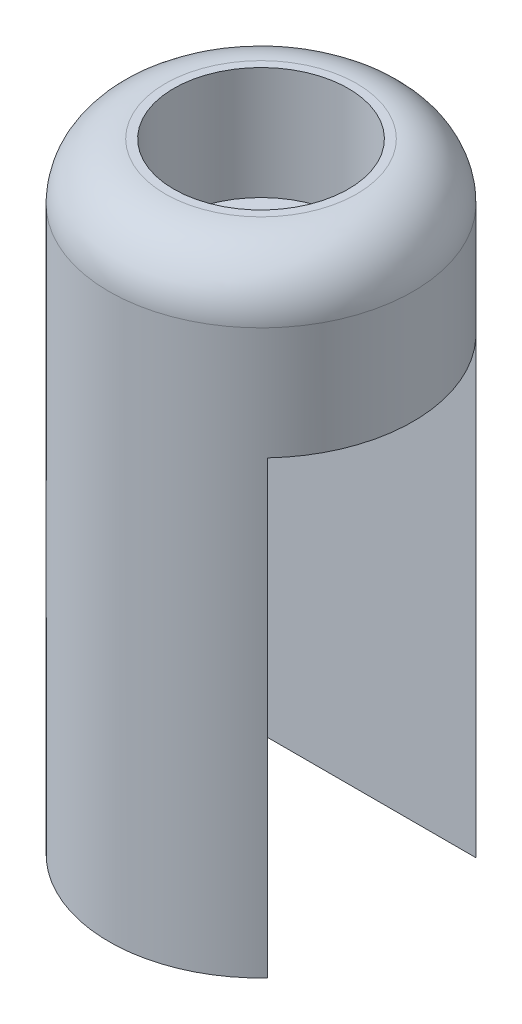
ISO-10303-21;
HEADER;
FILE_DESCRIPTION(('STEP AP214'),'2;1');
FILE_NAME('part.step','',(''),(''),'','','');
FILE_SCHEMA(('AUTOMOTIVE_DESIGN { 1 0 10303 214 1 1 1 1 }'));
ENDSEC;
DATA;
#1=APPLICATION_CONTEXT('core data for automotive mechanical design processes');
#2=APPLICATION_PROTOCOL_DEFINITION('international standard','automotive_design',2000,#1);
#3=PRODUCT_CONTEXT('',#1,'mechanical');
#4=PRODUCT('Part','Part','',(#3));
#5=PRODUCT_RELATED_PRODUCT_CATEGORY('part','',(#4));
#6=PRODUCT_DEFINITION_FORMATION('','',#4);
#7=PRODUCT_DEFINITION_CONTEXT('part definition',#1,'design');
#8=PRODUCT_DEFINITION('design','',#6,#7);
#9=PRODUCT_DEFINITION_SHAPE('','',#8);
#10=(LENGTH_UNIT() NAMED_UNIT(*) SI_UNIT(.MILLI.,.METRE.));
#11=(NAMED_UNIT(*) PLANE_ANGLE_UNIT() SI_UNIT($,.RADIAN.));
#12=(NAMED_UNIT(*) SI_UNIT($,.STERADIAN.) SOLID_ANGLE_UNIT());
#13=UNCERTAINTY_MEASURE_WITH_UNIT(LENGTH_MEASURE(1.E-05),#10,'distance_accuracy_value','');
#14=(GEOMETRIC_REPRESENTATION_CONTEXT(3) GLOBAL_UNCERTAINTY_ASSIGNED_CONTEXT((#13)) GLOBAL_UNIT_ASSIGNED_CONTEXT((#10,
#11,#12)) REPRESENTATION_CONTEXT('',''));
#15=CARTESIAN_POINT('',(0.,0.,0.));
#16=DIRECTION('',(0.,0.,1.));
#17=DIRECTION('',(1.,0.,0.));
#18=AXIS2_PLACEMENT_3D('',#15,#16,#17);
#19=CARTESIAN_POINT('',(0.,0.,0.));
#20=DIRECTION('',(0.,1.,0.));
#21=DIRECTION('',(0.,0.,1.));
#22=AXIS2_PLACEMENT_3D('',#19,#20,#21);
#23=PLANE('',#22);
#24=CARTESIAN_POINT('',(0.,0.,0.));
#25=DIRECTION('',(0.,1.,0.));
#26=DIRECTION('',(0.,0.,1.));
#27=AXIS2_PLACEMENT_3D('',#24,#25,#26);
#28=CIRCLE('',#27,2.7);
#29=CARTESIAN_POINT('',(-1.96659604392971,0.,1.85));
#30=VERTEX_POINT('',#29);
#31=CARTESIAN_POINT('',(1.96659604392972,0.,1.85));
#32=VERTEX_POINT('',#31);
#33=EDGE_CURVE('E105',#30,#32,#28,.T.);
#34=ORIENTED_EDGE('',*,*,#33,.F.);
#35=DIRECTION('',(-1.,0.,0.));
#36=VECTOR('',#35,1.);
#37=CARTESIAN_POINT('',(1.96659604392971,0.,1.85));
#38=LINE('',#37,#36);
#39=EDGE_CURVE('E71',#32,#30,#38,.T.);
#40=ORIENTED_EDGE('',*,*,#39,.F.);
#41=EDGE_LOOP('',(#34,#40));
#42=FACE_BOUND('',#41,.T.);
#43=ADVANCED_FACE('F33',(#42),#23,.F.);
#44=CARTESIAN_POINT('',(0.,11.,0.));
#45=DIRECTION('',(0.,-1.,0.));
#46=DIRECTION('',(0.,0.,-1.));
#47=AXIS2_PLACEMENT_3D('',#44,#45,#46);
#48=CYLINDRICAL_SURFACE('',#47,2.7);
#49=CARTESIAN_POINT('',(0.,10.,0.));
#50=DIRECTION('',(0.,1.,0.));
#51=DIRECTION('',(0.,0.,1.));
#52=AXIS2_PLACEMENT_3D('',#49,#50,#51);
#53=CIRCLE('',#52,2.7);
#54=CARTESIAN_POINT('',(0.,10.,2.7));
#55=VERTEX_POINT('',#54);
#56=EDGE_CURVE('E11',#55,#55,#53,.F.);
#57=ORIENTED_EDGE('',*,*,#56,.T.);
#58=EDGE_LOOP('',(#57));
#59=FACE_BOUND('',#58,.T.);
#60=ORIENTED_EDGE('',*,*,#33,.T.);
#61=DIRECTION('',(0.,-1.,0.));
#62=VECTOR('',#61,1.);
#63=CARTESIAN_POINT('',(1.96659604392972,8.,1.85));
#64=LINE('',#63,#62);
#65=CARTESIAN_POINT('',(1.96659604392972,8.,1.85));
#66=VERTEX_POINT('',#65);
#67=EDGE_CURVE('E85',#66,#32,#64,.T.);
#68=ORIENTED_EDGE('',*,*,#67,.F.);
#69=CARTESIAN_POINT('',(0.,8.,0.));
#70=DIRECTION('',(0.,-1.,0.));
#71=DIRECTION('',(0.,0.,-1.));
#72=AXIS2_PLACEMENT_3D('',#69,#70,#71);
#73=CIRCLE('',#72,2.7);
#74=CARTESIAN_POINT('',(1.96659604392971,8.,-1.85));
#75=VERTEX_POINT('',#74);
#76=EDGE_CURVE('E89',#75,#66,#73,.T.);
#77=ORIENTED_EDGE('',*,*,#76,.F.);
#78=DIRECTION('',(0.,-1.,0.));
#79=VECTOR('',#78,1.);
#80=CARTESIAN_POINT('',(1.96659604392971,8.,-1.85));
#81=LINE('',#80,#79);
#82=CARTESIAN_POINT('',(1.96659604392971,0.,-1.85));
#83=VERTEX_POINT('',#82);
#84=EDGE_CURVE('E78',#75,#83,#81,.T.);
#85=ORIENTED_EDGE('',*,*,#84,.T.);
#86=CARTESIAN_POINT('',(-1.96659604392971,0.,-1.85));
#87=VERTEX_POINT('',#86);
#88=EDGE_CURVE('E108',#83,#87,#28,.T.);
#89=ORIENTED_EDGE('',*,*,#88,.T.);
#90=DIRECTION('',(0.,-1.,0.));
#91=VECTOR('',#90,1.);
#92=CARTESIAN_POINT('',(-1.96659604392971,8.,-1.85));
#93=LINE('',#92,#91);
#94=CARTESIAN_POINT('',(-1.96659604392971,8.,-1.85));
#95=VERTEX_POINT('',#94);
#96=EDGE_CURVE('E48',#95,#87,#93,.T.);
#97=ORIENTED_EDGE('',*,*,#96,.F.);
#98=CARTESIAN_POINT('',(0.,8.,0.));
#99=DIRECTION('',(0.,-1.,0.));
#100=DIRECTION('',(0.,0.,-1.));
#101=AXIS2_PLACEMENT_3D('',#98,#99,#100);
#102=CIRCLE('',#101,2.7);
#103=CARTESIAN_POINT('',(-1.96659604392971,8.,1.85));
#104=VERTEX_POINT('',#103);
#105=EDGE_CURVE('E91',#104,#95,#102,.T.);
#106=ORIENTED_EDGE('',*,*,#105,.F.);
#107=DIRECTION('',(0.,-1.,0.));
#108=VECTOR('',#107,1.);
#109=CARTESIAN_POINT('',(-1.96659604392971,8.,1.85));
#110=LINE('',#109,#108);
#111=EDGE_CURVE('E57',#104,#30,#110,.T.);
#112=ORIENTED_EDGE('',*,*,#111,.T.);
#113=EDGE_LOOP('',(#60,#68,#77,#85,#89,#97,#106,#112));
#114=FACE_BOUND('',#113,.T.);
#115=ADVANCED_FACE('F95',(#59,#114),#48,.T.);
#116=CARTESIAN_POINT('',(0.,11.,0.));
#117=DIRECTION('',(0.,1.,0.));
#118=DIRECTION('',(0.,0.,1.));
#119=AXIS2_PLACEMENT_3D('',#116,#117,#118);
#120=PLANE('',#119);
#121=CARTESIAN_POINT('',(0.,11.,0.));
#122=DIRECTION('',(0.,1.,0.));
#123=DIRECTION('',(0.,0.,1.));
#124=AXIS2_PLACEMENT_3D('',#121,#122,#123);
#125=CIRCLE('',#124,1.7);
#126=CARTESIAN_POINT('',(0.,11.,1.7));
#127=VERTEX_POINT('',#126);
#128=EDGE_CURVE('E41',#127,#127,#125,.T.);
#129=ORIENTED_EDGE('',*,*,#128,.T.);
#130=EDGE_LOOP('',(#129));
#131=FACE_BOUND('',#130,.T.);
#132=CARTESIAN_POINT('',(0.,11.,0.));
#133=DIRECTION('',(0.,1.,0.));
#134=DIRECTION('',(0.,0.,1.));
#135=AXIS2_PLACEMENT_3D('',#132,#133,#134);
#136=CIRCLE('',#135,1.55);
#137=CARTESIAN_POINT('',(0.,11.,1.55));
#138=VERTEX_POINT('',#137);
#139=EDGE_CURVE('E132',#138,#138,#136,.T.);
#140=ORIENTED_EDGE('',*,*,#139,.F.);
#141=EDGE_LOOP('',(#140));
#142=FACE_BOUND('',#141,.T.);
#143=ADVANCED_FACE('F116',(#131,#142),#120,.T.);
#144=ORIENTED_EDGE('',*,*,#88,.F.);
#145=DIRECTION('',(1.,0.,0.));
#146=VECTOR('',#145,1.);
#147=CARTESIAN_POINT('',(1.96659604392971,0.,-1.85));
#148=LINE('',#147,#146);
#149=EDGE_CURVE('E80',#87,#83,#148,.T.);
#150=ORIENTED_EDGE('',*,*,#149,.F.);
#151=EDGE_LOOP('',(#144,#150));
#152=FACE_BOUND('',#151,.T.);
#153=ADVANCED_FACE('F113',(#152),#23,.F.);
#154=CARTESIAN_POINT('',(1.96659604392971,8.,1.85));
#155=DIRECTION('',(0.,0.,1.));
#156=DIRECTION('',(1.,0.,0.));
#157=AXIS2_PLACEMENT_3D('',#154,#155,#156);
#158=PLANE('',#157);
#159=ORIENTED_EDGE('',*,*,#39,.T.);
#160=ORIENTED_EDGE('',*,*,#111,.F.);
#161=DIRECTION('',(-1.,0.,0.));
#162=VECTOR('',#161,1.);
#163=CARTESIAN_POINT('',(1.96659604392971,8.,1.85));
#164=LINE('',#163,#162);
#165=EDGE_CURVE('E96',#66,#104,#164,.T.);
#166=ORIENTED_EDGE('',*,*,#165,.F.);
#167=ORIENTED_EDGE('',*,*,#67,.T.);
#168=EDGE_LOOP('',(#159,#160,#166,#167));
#169=FACE_BOUND('',#168,.T.);
#170=ADVANCED_FACE('F115',(#169),#158,.F.);
#171=CARTESIAN_POINT('',(1.96659604392971,8.,-1.85));
#172=DIRECTION('',(0.,0.,-1.));
#173=DIRECTION('',(-1.,0.,0.));
#174=AXIS2_PLACEMENT_3D('',#171,#172,#173);
#175=PLANE('',#174);
#176=ORIENTED_EDGE('',*,*,#149,.T.);
#177=ORIENTED_EDGE('',*,*,#84,.F.);
#178=DIRECTION('',(1.,0.,0.));
#179=VECTOR('',#178,1.);
#180=CARTESIAN_POINT('',(1.96659604392971,8.,-1.85));
#181=LINE('',#180,#179);
#182=EDGE_CURVE('E75',#95,#75,#181,.T.);
#183=ORIENTED_EDGE('',*,*,#182,.F.);
#184=ORIENTED_EDGE('',*,*,#96,.T.);
#185=EDGE_LOOP('',(#176,#177,#183,#184));
#186=FACE_BOUND('',#185,.T.);
#187=ADVANCED_FACE('F79',(#186),#175,.F.);
#188=CARTESIAN_POINT('',(0.,8.,0.));
#189=DIRECTION('',(0.,-1.,0.));
#190=DIRECTION('',(0.,0.,-1.));
#191=AXIS2_PLACEMENT_3D('',#188,#189,#190);
#192=PLANE('',#191);
#193=ORIENTED_EDGE('',*,*,#105,.T.);
#194=ORIENTED_EDGE('',*,*,#182,.T.);
#195=ORIENTED_EDGE('',*,*,#76,.T.);
#196=ORIENTED_EDGE('',*,*,#165,.T.);
#197=EDGE_LOOP('',(#193,#194,#195,#196));
#198=FACE_BOUND('',#197,.T.);
#199=ADVANCED_FACE('F88',(#198),#192,.T.);
#200=CARTESIAN_POINT('',(0.,9.,0.));
#201=DIRECTION('',(0.,1.,0.));
#202=DIRECTION('',(0.,0.,1.));
#203=AXIS2_PLACEMENT_3D('',#200,#201,#202);
#204=CYLINDRICAL_SURFACE('',#203,1.55);
#205=CARTESIAN_POINT('',(0.,9.,0.));
#206=DIRECTION('',(0.,1.,0.));
#207=DIRECTION('',(0.,0.,1.));
#208=AXIS2_PLACEMENT_3D('',#205,#206,#207);
#209=CIRCLE('',#208,1.55);
#210=CARTESIAN_POINT('',(0.,9.,1.55));
#211=VERTEX_POINT('',#210);
#212=EDGE_CURVE('E102',#211,#211,#209,.T.);
#213=ORIENTED_EDGE('',*,*,#212,.F.);
#214=EDGE_LOOP('',(#213));
#215=FACE_BOUND('',#214,.T.);
#216=ORIENTED_EDGE('',*,*,#139,.T.);
#217=EDGE_LOOP('',(#216));
#218=FACE_BOUND('',#217,.T.);
#219=ADVANCED_FACE('F140',(#215,#218),#204,.F.);
#220=CARTESIAN_POINT('',(0.,9.,0.));
#221=DIRECTION('',(0.,1.,0.));
#222=DIRECTION('',(0.,0.,1.));
#223=AXIS2_PLACEMENT_3D('',#220,#221,#222);
#224=PLANE('',#223);
#225=ORIENTED_EDGE('',*,*,#212,.T.);
#226=EDGE_LOOP('',(#225));
#227=FACE_BOUND('',#226,.T.);
#228=ADVANCED_FACE('F138',(#227),#224,.T.);
#229=CARTESIAN_POINT('',(0.,10.,0.));
#230=DIRECTION('',(0.,1.,0.));
#231=DIRECTION('',(0.,0.,1.));
#232=AXIS2_PLACEMENT_3D('',#229,#230,#231);
#233=TOROIDAL_SURFACE('',#232,1.7,1.);
#234=ORIENTED_EDGE('',*,*,#56,.F.);
#235=EDGE_LOOP('',(#234));
#236=FACE_BOUND('',#235,.T.);
#237=ORIENTED_EDGE('',*,*,#128,.F.);
#238=EDGE_LOOP('',(#237));
#239=FACE_BOUND('',#238,.T.);
#240=ADVANCED_FACE('F35',(#236,#239),#233,.T.);
#241=CLOSED_SHELL('',(#43,#115,#143,#153,#170,#187,#199,#219,#228,#240));
#242=MANIFOLD_SOLID_BREP('B2',#241);
#243=ADVANCED_BREP_SHAPE_REPRESENTATION('',(#18,#242),#14);
#244=SHAPE_DEFINITION_REPRESENTATION(#9,#243);
ENDSEC;
END-ISO-10303-21;
